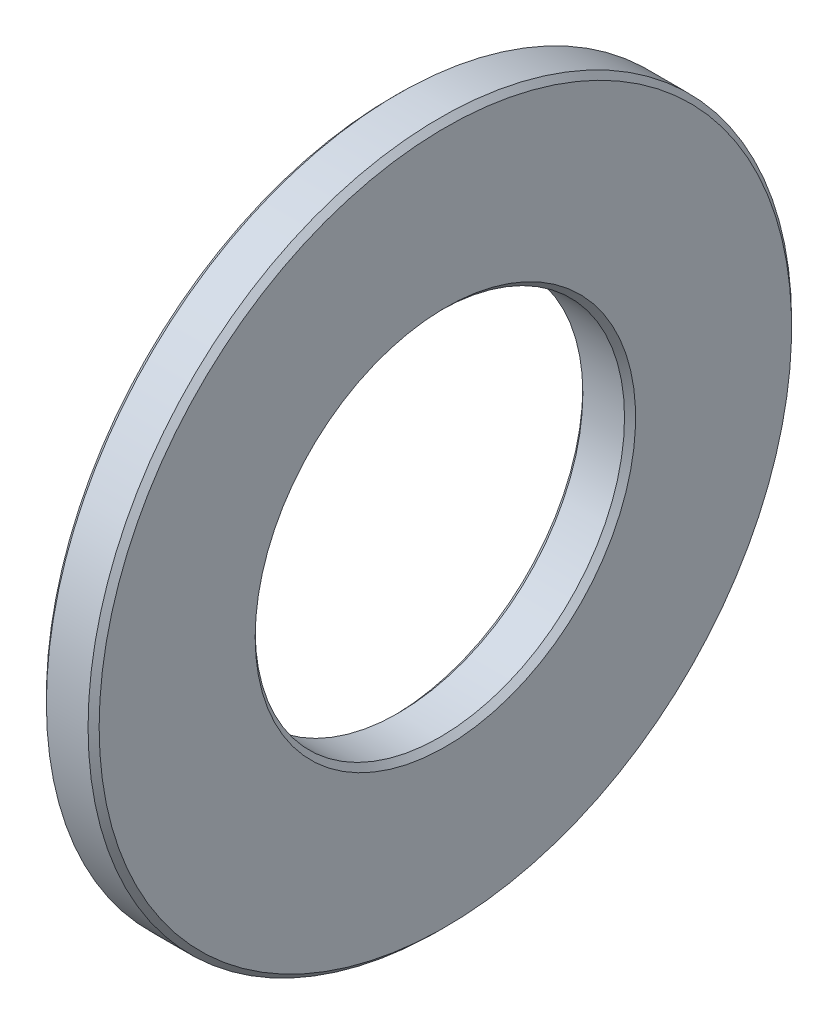
ISO-10303-21;
HEADER;
FILE_DESCRIPTION(('STEP AP214'),'2;1');
FILE_NAME('part.step','',(''),(''),'','','');
FILE_SCHEMA(('AUTOMOTIVE_DESIGN { 1 0 10303 214 1 1 1 1 }'));
ENDSEC;
DATA;
#1=APPLICATION_CONTEXT('core data for automotive mechanical design processes');
#2=APPLICATION_PROTOCOL_DEFINITION('international standard','automotive_design',2000,#1);
#3=PRODUCT_CONTEXT('',#1,'mechanical');
#4=PRODUCT('Part','Part','',(#3));
#5=PRODUCT_RELATED_PRODUCT_CATEGORY('part','',(#4));
#6=PRODUCT_DEFINITION_FORMATION('','',#4);
#7=PRODUCT_DEFINITION_CONTEXT('part definition',#1,'design');
#8=PRODUCT_DEFINITION('design','',#6,#7);
#9=PRODUCT_DEFINITION_SHAPE('','',#8);
#10=(LENGTH_UNIT() NAMED_UNIT(*) SI_UNIT(.MILLI.,.METRE.));
#11=(NAMED_UNIT(*) PLANE_ANGLE_UNIT() SI_UNIT($,.RADIAN.));
#12=(NAMED_UNIT(*) SI_UNIT($,.STERADIAN.) SOLID_ANGLE_UNIT());
#13=UNCERTAINTY_MEASURE_WITH_UNIT(LENGTH_MEASURE(1.E-05),#10,'distance_accuracy_value','');
#14=(GEOMETRIC_REPRESENTATION_CONTEXT(3) GLOBAL_UNCERTAINTY_ASSIGNED_CONTEXT((#13)) GLOBAL_UNIT_ASSIGNED_CONTEXT((#10,
#11,#12)) REPRESENTATION_CONTEXT('',''));
#15=CARTESIAN_POINT('',(0.,0.,0.));
#16=DIRECTION('',(0.,0.,1.));
#17=DIRECTION('',(1.,0.,0.));
#18=AXIS2_PLACEMENT_3D('',#15,#16,#17);
#19=CARTESIAN_POINT('',(0.,15.875,0.));
#20=DIRECTION('',(1.,0.,0.));
#21=DIRECTION('',(0.,0.,-1.));
#22=AXIS2_PLACEMENT_3D('',#19,#20,#21);
#23=PLANE('',#22);
#24=CARTESIAN_POINT('',(0.,0.,0.));
#25=DIRECTION('',(1.,0.,0.));
#26=DIRECTION('',(0.,0.,-1.));
#27=AXIS2_PLACEMENT_3D('',#24,#25,#26);
#28=CIRCLE('',#27,8.584375);
#29=CARTESIAN_POINT('',(0.,0.,-8.584375));
#30=VERTEX_POINT('',#29);
#31=EDGE_CURVE('E55',#30,#30,#28,.T.);
#32=ORIENTED_EDGE('',*,*,#31,.T.);
#33=EDGE_LOOP('',(#32));
#34=FACE_BOUND('',#33,.T.);
#35=CARTESIAN_POINT('',(0.,0.,0.));
#36=DIRECTION('',(1.,0.,0.));
#37=DIRECTION('',(0.,0.,-1.));
#38=AXIS2_PLACEMENT_3D('',#35,#36,#37);
#39=CIRCLE('',#38,15.625);
#40=CARTESIAN_POINT('',(0.,0.,-15.625));
#41=VERTEX_POINT('',#40);
#42=EDGE_CURVE('E58',#41,#41,#39,.F.);
#43=ORIENTED_EDGE('',*,*,#42,.T.);
#44=EDGE_LOOP('',(#43));
#45=FACE_BOUND('',#44,.T.);
#46=ADVANCED_FACE('F35',(#34,#45),#23,.F.);
#47=CARTESIAN_POINT('',(0.,0.,0.));
#48=DIRECTION('',(-1.,0.,0.));
#49=DIRECTION('',(0.,0.,1.));
#50=AXIS2_PLACEMENT_3D('',#47,#48,#49);
#51=CYLINDRICAL_SURFACE('',#50,8.334375);
#52=CARTESIAN_POINT('',(0.250000000000006,0.,0.));
#53=DIRECTION('',(1.,0.,0.));
#54=DIRECTION('',(0.,0.,-1.));
#55=AXIS2_PLACEMENT_3D('',#52,#53,#54);
#56=CIRCLE('',#55,8.334375);
#57=CARTESIAN_POINT('',(0.250000000000006,0.,-8.334375));
#58=VERTEX_POINT('',#57);
#59=EDGE_CURVE('E61',#58,#58,#56,.F.);
#60=ORIENTED_EDGE('',*,*,#59,.T.);
#61=EDGE_LOOP('',(#60));
#62=FACE_BOUND('',#61,.T.);
#63=CARTESIAN_POINT('',(2.13125,0.,0.));
#64=DIRECTION('',(-1.,0.,0.));
#65=DIRECTION('',(0.,0.,1.));
#66=AXIS2_PLACEMENT_3D('',#63,#64,#65);
#67=CIRCLE('',#66,8.334375);
#68=CARTESIAN_POINT('',(2.13125,0.,8.334375));
#69=VERTEX_POINT('',#68);
#70=EDGE_CURVE('E64',#69,#69,#67,.F.);
#71=ORIENTED_EDGE('',*,*,#70,.T.);
#72=EDGE_LOOP('',(#71));
#73=FACE_BOUND('',#72,.T.);
#74=ADVANCED_FACE('F68',(#62,#73),#51,.F.);
#75=CARTESIAN_POINT('',(2.38125,8.334375,0.));
#76=DIRECTION('',(-1.,0.,0.));
#77=DIRECTION('',(0.,0.,1.));
#78=AXIS2_PLACEMENT_3D('',#75,#76,#77);
#79=PLANE('',#78);
#80=CARTESIAN_POINT('',(2.38125,0.,0.));
#81=DIRECTION('',(-1.,0.,0.));
#82=DIRECTION('',(0.,0.,1.));
#83=AXIS2_PLACEMENT_3D('',#80,#81,#82);
#84=CIRCLE('',#83,8.58437499999999);
#85=CARTESIAN_POINT('',(2.38125,0.,8.58437499999999));
#86=VERTEX_POINT('',#85);
#87=EDGE_CURVE('E46',#86,#86,#84,.T.);
#88=ORIENTED_EDGE('',*,*,#87,.T.);
#89=EDGE_LOOP('',(#88));
#90=FACE_BOUND('',#89,.T.);
#91=CARTESIAN_POINT('',(2.38125,0.,0.));
#92=DIRECTION('',(-1.,0.,0.));
#93=DIRECTION('',(0.,0.,1.));
#94=AXIS2_PLACEMENT_3D('',#91,#92,#93);
#95=CIRCLE('',#94,15.625);
#96=CARTESIAN_POINT('',(2.38125,0.,15.625));
#97=VERTEX_POINT('',#96);
#98=EDGE_CURVE('E50',#97,#97,#95,.F.);
#99=ORIENTED_EDGE('',*,*,#98,.T.);
#100=EDGE_LOOP('',(#99));
#101=FACE_BOUND('',#100,.T.);
#102=ADVANCED_FACE('F78',(#90,#101),#79,.F.);
#103=CARTESIAN_POINT('',(0.,0.,0.));
#104=DIRECTION('',(-1.,0.,0.));
#105=DIRECTION('',(0.,0.,1.));
#106=AXIS2_PLACEMENT_3D('',#103,#104,#105);
#107=CYLINDRICAL_SURFACE('',#106,15.875);
#108=CARTESIAN_POINT('',(2.13125000000001,0.,0.));
#109=DIRECTION('',(-1.,0.,0.));
#110=DIRECTION('',(0.,0.,1.));
#111=AXIS2_PLACEMENT_3D('',#108,#109,#110);
#112=CIRCLE('',#111,15.875);
#113=CARTESIAN_POINT('',(2.13125000000001,0.,15.875));
#114=VERTEX_POINT('',#113);
#115=EDGE_CURVE('E10',#114,#114,#112,.T.);
#116=ORIENTED_EDGE('',*,*,#115,.T.);
#117=EDGE_LOOP('',(#116));
#118=FACE_BOUND('',#117,.T.);
#119=CARTESIAN_POINT('',(0.249999999999994,0.,0.));
#120=DIRECTION('',(1.,0.,0.));
#121=DIRECTION('',(0.,0.,-1.));
#122=AXIS2_PLACEMENT_3D('',#119,#120,#121);
#123=CIRCLE('',#122,15.875);
#124=CARTESIAN_POINT('',(0.249999999999994,0.,-15.875));
#125=VERTEX_POINT('',#124);
#126=EDGE_CURVE('E42',#125,#125,#123,.T.);
#127=ORIENTED_EDGE('',*,*,#126,.T.);
#128=EDGE_LOOP('',(#127));
#129=FACE_BOUND('',#128,.T.);
#130=ADVANCED_FACE('F81',(#118,#129),#107,.T.);
#131=CARTESIAN_POINT('',(0.250000000000006,0.,0.));
#132=DIRECTION('',(-1.,0.,0.));
#133=DIRECTION('',(0.,0.,1.));
#134=AXIS2_PLACEMENT_3D('',#131,#132,#133);
#135=CONICAL_SURFACE('',#134,8.334375,0.785398163397448);
#136=ORIENTED_EDGE('',*,*,#31,.F.);
#137=EDGE_LOOP('',(#136));
#138=FACE_BOUND('',#137,.T.);
#139=ORIENTED_EDGE('',*,*,#59,.F.);
#140=EDGE_LOOP('',(#139));
#141=FACE_BOUND('',#140,.T.);
#142=ADVANCED_FACE('F74',(#138,#141),#135,.F.);
#143=CARTESIAN_POINT('',(2.38125,0.,0.));
#144=DIRECTION('',(1.,0.,0.));
#145=DIRECTION('',(0.,0.,-1.));
#146=AXIS2_PLACEMENT_3D('',#143,#144,#145);
#147=CONICAL_SURFACE('',#146,8.58437499999999,0.785398163397441);
#148=ORIENTED_EDGE('',*,*,#70,.F.);
#149=EDGE_LOOP('',(#148));
#150=FACE_BOUND('',#149,.T.);
#151=ORIENTED_EDGE('',*,*,#87,.F.);
#152=EDGE_LOOP('',(#151));
#153=FACE_BOUND('',#152,.T.);
#154=ADVANCED_FACE('F70',(#150,#153),#147,.F.);
#155=CARTESIAN_POINT('',(2.13125000000001,0.,0.));
#156=DIRECTION('',(-1.,0.,0.));
#157=DIRECTION('',(0.,0.,1.));
#158=AXIS2_PLACEMENT_3D('',#155,#156,#157);
#159=CONICAL_SURFACE('',#158,15.875,0.785398163397448);
#160=ORIENTED_EDGE('',*,*,#98,.F.);
#161=EDGE_LOOP('',(#160));
#162=FACE_BOUND('',#161,.T.);
#163=ORIENTED_EDGE('',*,*,#115,.F.);
#164=EDGE_LOOP('',(#163));
#165=FACE_BOUND('',#164,.T.);
#166=ADVANCED_FACE('F73',(#162,#165),#159,.T.);
#167=CARTESIAN_POINT('',(0.,0.,0.));
#168=DIRECTION('',(1.,0.,0.));
#169=DIRECTION('',(0.,0.,-1.));
#170=AXIS2_PLACEMENT_3D('',#167,#168,#169);
#171=CONICAL_SURFACE('',#170,15.625,0.785398163397448);
#172=ORIENTED_EDGE('',*,*,#126,.F.);
#173=EDGE_LOOP('',(#172));
#174=FACE_BOUND('',#173,.T.);
#175=ORIENTED_EDGE('',*,*,#42,.F.);
#176=EDGE_LOOP('',(#175));
#177=FACE_BOUND('',#176,.T.);
#178=ADVANCED_FACE('F37',(#174,#177),#171,.T.);
#179=CLOSED_SHELL('',(#46,#74,#102,#130,#142,#154,#166,#178));
#180=MANIFOLD_SOLID_BREP('B2',#179);
#181=ADVANCED_BREP_SHAPE_REPRESENTATION('',(#18,#180),#14);
#182=SHAPE_DEFINITION_REPRESENTATION(#9,#181);
ENDSEC;
END-ISO-10303-21;
